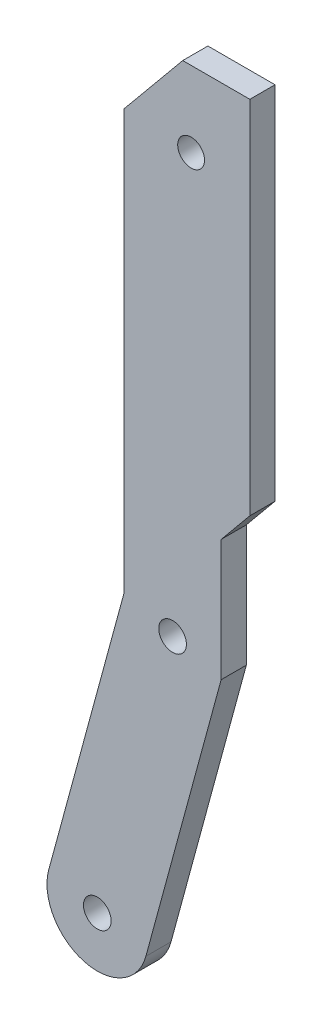
ISO-10303-21;
HEADER;
FILE_DESCRIPTION(('STEP AP214'),'2;1');
FILE_NAME('part.step','',(''),(''),'','','');
FILE_SCHEMA(('AUTOMOTIVE_DESIGN { 1 0 10303 214 1 1 1 1 }'));
ENDSEC;
DATA;
#1=APPLICATION_CONTEXT('core data for automotive mechanical design processes');
#2=APPLICATION_PROTOCOL_DEFINITION('international standard','automotive_design',2000,#1);
#3=PRODUCT_CONTEXT('',#1,'mechanical');
#4=PRODUCT('Part','Part','',(#3));
#5=PRODUCT_RELATED_PRODUCT_CATEGORY('part','',(#4));
#6=PRODUCT_DEFINITION_FORMATION('','',#4);
#7=PRODUCT_DEFINITION_CONTEXT('part definition',#1,'design');
#8=PRODUCT_DEFINITION('design','',#6,#7);
#9=PRODUCT_DEFINITION_SHAPE('','',#8);
#10=(LENGTH_UNIT() NAMED_UNIT(*) SI_UNIT(.MILLI.,.METRE.));
#11=(NAMED_UNIT(*) PLANE_ANGLE_UNIT() SI_UNIT($,.RADIAN.));
#12=(NAMED_UNIT(*) SI_UNIT($,.STERADIAN.) SOLID_ANGLE_UNIT());
#13=UNCERTAINTY_MEASURE_WITH_UNIT(LENGTH_MEASURE(1.E-05),#10,'distance_accuracy_value','');
#14=(GEOMETRIC_REPRESENTATION_CONTEXT(3) GLOBAL_UNCERTAINTY_ASSIGNED_CONTEXT((#13)) GLOBAL_UNIT_ASSIGNED_CONTEXT((#10,
#11,#12)) REPRESENTATION_CONTEXT('',''));
#15=CARTESIAN_POINT('',(0.,0.,0.));
#16=DIRECTION('',(0.,0.,1.));
#17=DIRECTION('',(1.,0.,0.));
#18=AXIS2_PLACEMENT_3D('',#15,#16,#17);
#19=CARTESIAN_POINT('',(-34.23086743438,0.,3.));
#20=DIRECTION('',(-1.,0.,0.));
#21=DIRECTION('',(0.,0.,1.));
#22=AXIS2_PLACEMENT_3D('',#19,#20,#21);
#23=PLANE('',#22);
#24=DIRECTION('',(0.,1.,0.));
#25=VECTOR('',#24,1.);
#26=CARTESIAN_POINT('',(-34.23086743438,0.,0.));
#27=LINE('',#26,#25);
#28=CARTESIAN_POINT('',(-34.2308674343806,39.5851457958507,0.));
#29=VERTEX_POINT('',#28);
#30=CARTESIAN_POINT('',(-34.23086743438,89.5851457958505,0.));
#31=VERTEX_POINT('',#30);
#32=EDGE_CURVE('E146',#29,#31,#27,.T.);
#33=ORIENTED_EDGE('',*,*,#32,.F.);
#34=DIRECTION('',(0.,0.,-1.));
#35=VECTOR('',#34,1.);
#36=CARTESIAN_POINT('',(-34.2308674343806,39.5851457958507,3.));
#37=LINE('',#36,#35);
#38=CARTESIAN_POINT('',(-34.2308674343806,39.5851457958507,3.));
#39=VERTEX_POINT('',#38);
#40=EDGE_CURVE('E11',#39,#29,#37,.T.);
#41=ORIENTED_EDGE('',*,*,#40,.F.);
#42=DIRECTION('',(0.,1.,0.));
#43=VECTOR('',#42,1.);
#44=CARTESIAN_POINT('',(-34.23086743438,0.,3.));
#45=LINE('',#44,#43);
#46=CARTESIAN_POINT('',(-34.23086743438,89.5851457958505,3.));
#47=VERTEX_POINT('',#46);
#48=EDGE_CURVE('E295',#39,#47,#45,.T.);
#49=ORIENTED_EDGE('',*,*,#48,.T.);
#50=DIRECTION('',(0.,0.,-1.));
#51=VECTOR('',#50,1.);
#52=CARTESIAN_POINT('',(-34.23086743438,89.5851457958505,3.));
#53=LINE('',#52,#51);
#54=EDGE_CURVE('E53',#47,#31,#53,.T.);
#55=ORIENTED_EDGE('',*,*,#54,.T.);
#56=EDGE_LOOP('',(#33,#41,#49,#55));
#57=FACE_BOUND('',#56,.T.);
#58=ADVANCED_FACE('F36',(#57),#23,.T.);
#59=CARTESIAN_POINT('',(-41.8913719289719,11.3761069547162,3.));
#60=DIRECTION('',(-0.965048701977236,0.262070606539634,0.));
#61=DIRECTION('',(-0.262070606539634,-0.965048701977236,0.));
#62=AXIS2_PLACEMENT_3D('',#59,#60,#61);
#63=PLANE('',#62);
#64=DIRECTION('',(0.262070606539634,0.965048701977236,0.));
#65=VECTOR('',#64,1.);
#66=CARTESIAN_POINT('',(-41.8913719289719,11.3761069547162,0.));
#67=LINE('',#66,#65);
#68=CARTESIAN_POINT('',(-43.2036515790819,6.54376886960462,0.));
#69=VERTEX_POINT('',#68);
#70=EDGE_CURVE('E148',#69,#29,#67,.T.);
#71=ORIENTED_EDGE('',*,*,#70,.F.);
#72=DIRECTION('',(0.,0.,-1.));
#73=VECTOR('',#72,1.);
#74=CARTESIAN_POINT('',(-43.2036515790819,6.54376886960462,3.));
#75=LINE('',#74,#73);
#76=CARTESIAN_POINT('',(-43.2036515790819,6.54376886960462,3.));
#77=VERTEX_POINT('',#76);
#78=EDGE_CURVE('E45',#77,#69,#75,.T.);
#79=ORIENTED_EDGE('',*,*,#78,.F.);
#80=DIRECTION('',(0.262070606539634,0.965048701977236,0.));
#81=VECTOR('',#80,1.);
#82=CARTESIAN_POINT('',(-41.8913719289719,11.3761069547162,3.));
#83=LINE('',#82,#81);
#84=EDGE_CURVE('E200',#77,#39,#83,.T.);
#85=ORIENTED_EDGE('',*,*,#84,.T.);
#86=ORIENTED_EDGE('',*,*,#40,.T.);
#87=EDGE_LOOP('',(#71,#79,#85,#86));
#88=FACE_BOUND('',#87,.T.);
#89=ADVANCED_FACE('F199',(#88),#63,.T.);
#90=CARTESIAN_POINT('',(-37.4133593672185,4.97134523036682,3.));
#91=DIRECTION('',(0.,0.,-1.));
#92=DIRECTION('',(-1.,0.,0.));
#93=AXIS2_PLACEMENT_3D('',#90,#91,#92);
#94=CYLINDRICAL_SURFACE('',#93,6.);
#95=CARTESIAN_POINT('',(-37.4133593672185,4.97134523036682,0.));
#96=DIRECTION('',(0.,0.,1.));
#97=DIRECTION('',(1.,0.,0.));
#98=AXIS2_PLACEMENT_3D('',#95,#96,#97);
#99=CIRCLE('',#98,6.);
#100=CARTESIAN_POINT('',(-31.6230671553551,3.39892159112893,0.));
#101=VERTEX_POINT('',#100);
#102=EDGE_CURVE('E151',#69,#101,#99,.T.);
#103=ORIENTED_EDGE('',*,*,#102,.T.);
#104=DIRECTION('',(0.,0.,-1.));
#105=VECTOR('',#104,1.);
#106=CARTESIAN_POINT('',(-31.6230671553551,3.39892159112893,3.));
#107=LINE('',#106,#105);
#108=CARTESIAN_POINT('',(-31.6230671553551,3.39892159112893,3.));
#109=VERTEX_POINT('',#108);
#110=EDGE_CURVE('E183',#109,#101,#107,.T.);
#111=ORIENTED_EDGE('',*,*,#110,.F.);
#112=CARTESIAN_POINT('',(-37.4133593672185,4.97134523036682,3.));
#113=DIRECTION('',(0.,0.,1.));
#114=DIRECTION('',(1.,0.,0.));
#115=AXIS2_PLACEMENT_3D('',#112,#113,#114);
#116=CIRCLE('',#115,6.);
#117=EDGE_CURVE('E191',#77,#109,#116,.T.);
#118=ORIENTED_EDGE('',*,*,#117,.F.);
#119=ORIENTED_EDGE('',*,*,#78,.T.);
#120=EDGE_LOOP('',(#103,#111,#118,#119));
#121=FACE_BOUND('',#120,.T.);
#122=ADVANCED_FACE('F188',(#121),#94,.T.);
#123=CARTESIAN_POINT('',(-30.3107875052449,8.23125967624103,3.));
#124=DIRECTION('',(-0.965048701977232,0.262070606539649,0.));
#125=DIRECTION('',(-0.262070606539649,-0.965048701977232,0.));
#126=AXIS2_PLACEMENT_3D('',#123,#124,#125);
#127=PLANE('',#126);
#128=DIRECTION('',(0.262070606539649,0.965048701977232,0.));
#129=VECTOR('',#128,1.);
#130=CARTESIAN_POINT('',(-30.3107875052449,8.23125967624103,0.));
#131=LINE('',#130,#129);
#132=CARTESIAN_POINT('',(-22.6502830106532,36.4402985173747,0.));
#133=VERTEX_POINT('',#132);
#134=EDGE_CURVE('E154',#101,#133,#131,.T.);
#135=ORIENTED_EDGE('',*,*,#134,.T.);
#136=DIRECTION('',(0.,0.,-1.));
#137=VECTOR('',#136,1.);
#138=CARTESIAN_POINT('',(-22.6502830106532,36.4402985173747,3.));
#139=LINE('',#138,#137);
#140=CARTESIAN_POINT('',(-22.6502830106532,36.4402985173747,3.));
#141=VERTEX_POINT('',#140);
#142=EDGE_CURVE('E181',#141,#133,#139,.T.);
#143=ORIENTED_EDGE('',*,*,#142,.F.);
#144=DIRECTION('',(0.262070606539649,0.965048701977232,0.));
#145=VECTOR('',#144,1.);
#146=CARTESIAN_POINT('',(-30.3107875052449,8.23125967624103,3.));
#147=LINE('',#146,#145);
#148=EDGE_CURVE('E301',#109,#141,#147,.T.);
#149=ORIENTED_EDGE('',*,*,#148,.F.);
#150=ORIENTED_EDGE('',*,*,#110,.T.);
#151=EDGE_LOOP('',(#135,#143,#149,#150));
#152=FACE_BOUND('',#151,.T.);
#153=ADVANCED_FACE('F222',(#152),#127,.F.);
#154=CARTESIAN_POINT('',(-22.6502830106532,0.,3.));
#155=DIRECTION('',(1.,0.,0.));
#156=DIRECTION('',(0.,1.,0.));
#157=AXIS2_PLACEMENT_3D('',#154,#155,#156);
#158=PLANE('',#157);
#159=DIRECTION('',(0.,-1.,0.));
#160=VECTOR('',#159,1.);
#161=CARTESIAN_POINT('',(-22.6502830106532,0.,0.));
#162=LINE('',#161,#160);
#163=CARTESIAN_POINT('',(-22.6502830106533,50.9255690070684,0.));
#164=VERTEX_POINT('',#163);
#165=EDGE_CURVE('E157',#164,#133,#162,.T.);
#166=ORIENTED_EDGE('',*,*,#165,.F.);
#167=DIRECTION('',(0.,0.,-1.));
#168=VECTOR('',#167,1.);
#169=CARTESIAN_POINT('',(-22.6502830106533,50.9255690070684,3.));
#170=LINE('',#169,#168);
#171=CARTESIAN_POINT('',(-22.6502830106533,50.9255690070684,3.));
#172=VERTEX_POINT('',#171);
#173=EDGE_CURVE('E179',#172,#164,#170,.T.);
#174=ORIENTED_EDGE('',*,*,#173,.F.);
#175=DIRECTION('',(0.,-1.,0.));
#176=VECTOR('',#175,1.);
#177=CARTESIAN_POINT('',(-22.6502830106532,0.,3.));
#178=LINE('',#177,#176);
#179=EDGE_CURVE('E303',#172,#141,#178,.T.);
#180=ORIENTED_EDGE('',*,*,#179,.T.);
#181=ORIENTED_EDGE('',*,*,#142,.T.);
#182=EDGE_LOOP('',(#166,#174,#180,#181));
#183=FACE_BOUND('',#182,.T.);
#184=ADVANCED_FACE('F225',(#183),#158,.T.);
#185=CARTESIAN_POINT('',(-38.4764037350767,31.7414136628682,3.));
#186=DIRECTION('',(0.77138921583987,-0.636363636363637,0.));
#187=DIRECTION('',(0.636363636363637,0.77138921583987,0.));
#188=AXIS2_PLACEMENT_3D('',#185,#186,#187);
#189=PLANE('',#188);
#190=DIRECTION('',(-0.636363636363637,-0.77138921583987,0.));
#191=VECTOR('',#190,1.);
#192=CARTESIAN_POINT('',(-38.4764037350767,31.7414136628682,0.));
#193=LINE('',#192,#191);
#194=CARTESIAN_POINT('',(-19.23086743438,55.070526621373,0.));
#195=VERTEX_POINT('',#194);
#196=EDGE_CURVE('E160',#195,#164,#193,.T.);
#197=ORIENTED_EDGE('',*,*,#196,.F.);
#198=DIRECTION('',(0.,0.,-1.));
#199=VECTOR('',#198,1.);
#200=CARTESIAN_POINT('',(-19.23086743438,55.070526621373,3.));
#201=LINE('',#200,#199);
#202=CARTESIAN_POINT('',(-19.23086743438,55.070526621373,3.));
#203=VERTEX_POINT('',#202);
#204=EDGE_CURVE('E118',#203,#195,#201,.T.);
#205=ORIENTED_EDGE('',*,*,#204,.F.);
#206=DIRECTION('',(-0.636363636363637,-0.77138921583987,0.));
#207=VECTOR('',#206,1.);
#208=CARTESIAN_POINT('',(-38.4764037350767,31.7414136628682,3.));
#209=LINE('',#208,#207);
#210=EDGE_CURVE('E129',#203,#172,#209,.T.);
#211=ORIENTED_EDGE('',*,*,#210,.T.);
#212=ORIENTED_EDGE('',*,*,#173,.T.);
#213=EDGE_LOOP('',(#197,#205,#211,#212));
#214=FACE_BOUND('',#213,.T.);
#215=ADVANCED_FACE('F229',(#214),#189,.T.);
#216=CARTESIAN_POINT('',(-19.23086743438,0.,3.));
#217=DIRECTION('',(1.,0.,0.));
#218=DIRECTION('',(0.,1.,0.));
#219=AXIS2_PLACEMENT_3D('',#216,#217,#218);
#220=PLANE('',#219);
#221=DIRECTION('',(0.,-1.,0.));
#222=VECTOR('',#221,1.);
#223=CARTESIAN_POINT('',(-19.23086743438,0.,0.));
#224=LINE('',#223,#222);
#225=CARTESIAN_POINT('',(-19.23086743438,98.0704271700891,0.));
#226=VERTEX_POINT('',#225);
#227=EDGE_CURVE('E114',#226,#195,#224,.T.);
#228=ORIENTED_EDGE('',*,*,#227,.F.);
#229=DIRECTION('',(0.,0.,-1.));
#230=VECTOR('',#229,1.);
#231=CARTESIAN_POINT('',(-19.23086743438,98.0704271700891,3.));
#232=LINE('',#231,#230);
#233=CARTESIAN_POINT('',(-19.23086743438,98.0704271700891,3.));
#234=VERTEX_POINT('',#233);
#235=EDGE_CURVE('E109',#234,#226,#232,.T.);
#236=ORIENTED_EDGE('',*,*,#235,.F.);
#237=DIRECTION('',(0.,-1.,0.));
#238=VECTOR('',#237,1.);
#239=CARTESIAN_POINT('',(-19.23086743438,0.,3.));
#240=LINE('',#239,#238);
#241=EDGE_CURVE('E112',#234,#203,#240,.T.);
#242=ORIENTED_EDGE('',*,*,#241,.T.);
#243=ORIENTED_EDGE('',*,*,#204,.T.);
#244=EDGE_LOOP('',(#228,#236,#242,#243));
#245=FACE_BOUND('',#244,.T.);
#246=ADVANCED_FACE('F111',(#245),#220,.T.);
#247=CARTESIAN_POINT('',(0.,98.0704271700891,3.));
#248=DIRECTION('',(0.,1.,0.));
#249=DIRECTION('',(0.,0.,1.));
#250=AXIS2_PLACEMENT_3D('',#247,#248,#249);
#251=PLANE('',#250);
#252=DIRECTION('',(1.,0.,0.));
#253=VECTOR('',#252,1.);
#254=CARTESIAN_POINT('',(0.,98.0704271700891,0.));
#255=LINE('',#254,#253);
#256=CARTESIAN_POINT('',(-27.23086743438,98.0704271700891,0.));
#257=VERTEX_POINT('',#256);
#258=EDGE_CURVE('E164',#257,#226,#255,.T.);
#259=ORIENTED_EDGE('',*,*,#258,.F.);
#260=DIRECTION('',(0.,0.,-1.));
#261=VECTOR('',#260,1.);
#262=CARTESIAN_POINT('',(-27.23086743438,98.0704271700891,3.));
#263=LINE('',#262,#261);
#264=CARTESIAN_POINT('',(-27.23086743438,98.0704271700891,3.));
#265=VERTEX_POINT('',#264);
#266=EDGE_CURVE('E81',#265,#257,#263,.T.);
#267=ORIENTED_EDGE('',*,*,#266,.F.);
#268=DIRECTION('',(1.,0.,0.));
#269=VECTOR('',#268,1.);
#270=CARTESIAN_POINT('',(0.,98.0704271700891,3.));
#271=LINE('',#270,#269);
#272=EDGE_CURVE('E126',#265,#234,#271,.T.);
#273=ORIENTED_EDGE('',*,*,#272,.T.);
#274=ORIENTED_EDGE('',*,*,#235,.T.);
#275=EDGE_LOOP('',(#259,#267,#273,#274));
#276=FACE_BOUND('',#275,.T.);
#277=ADVANCED_FACE('F131',(#276),#251,.T.);
#278=CARTESIAN_POINT('',(-28.4405752225166,38.0127221566126,3.));
#279=DIRECTION('',(0.,0.,-1.));
#280=DIRECTION('',(-1.,0.,0.));
#281=AXIS2_PLACEMENT_3D('',#278,#279,#280);
#282=CYLINDRICAL_SURFACE('',#281,1.65);
#283=CARTESIAN_POINT('',(-28.4405752225166,38.0127221566126,3.));
#284=DIRECTION('',(0.,0.,1.));
#285=DIRECTION('',(1.,0.,0.));
#286=AXIS2_PLACEMENT_3D('',#283,#284,#285);
#287=CIRCLE('',#286,1.65);
#288=CARTESIAN_POINT('',(-26.7905752225166,38.0127221566126,3.));
#289=VERTEX_POINT('',#288);
#290=EDGE_CURVE('E134',#289,#289,#287,.T.);
#291=ORIENTED_EDGE('',*,*,#290,.T.);
#292=EDGE_LOOP('',(#291));
#293=FACE_BOUND('',#292,.T.);
#294=CARTESIAN_POINT('',(-28.4405752225166,38.0127221566126,0.));
#295=DIRECTION('',(0.,0.,1.));
#296=DIRECTION('',(1.,0.,0.));
#297=AXIS2_PLACEMENT_3D('',#294,#295,#296);
#298=CIRCLE('',#297,1.65);
#299=CARTESIAN_POINT('',(-26.7905752225166,38.0127221566126,0.));
#300=VERTEX_POINT('',#299);
#301=EDGE_CURVE('E169',#300,#300,#298,.T.);
#302=ORIENTED_EDGE('',*,*,#301,.F.);
#303=EDGE_LOOP('',(#302));
#304=FACE_BOUND('',#303,.T.);
#305=ADVANCED_FACE('F203',(#293,#304),#282,.F.);
#306=CARTESIAN_POINT('',(-64.3446994916133,53.0816689012521,3.));
#307=DIRECTION('',(-0.77138921583987,0.636363636363636,0.));
#308=DIRECTION('',(-0.636363636363636,-0.77138921583987,0.));
#309=AXIS2_PLACEMENT_3D('',#306,#307,#308);
#310=PLANE('',#309);
#311=DIRECTION('',(0.636363636363636,0.77138921583987,0.));
#312=VECTOR('',#311,1.);
#313=CARTESIAN_POINT('',(-64.3446994916133,53.0816689012521,0.));
#314=LINE('',#313,#312);
#315=EDGE_CURVE('E166',#31,#257,#314,.T.);
#316=ORIENTED_EDGE('',*,*,#315,.F.);
#317=ORIENTED_EDGE('',*,*,#54,.F.);
#318=DIRECTION('',(0.636363636363636,0.77138921583987,0.));
#319=VECTOR('',#318,1.);
#320=CARTESIAN_POINT('',(-64.3446994916133,53.0816689012521,3.));
#321=LINE('',#320,#319);
#322=EDGE_CURVE('E132',#47,#265,#321,.T.);
#323=ORIENTED_EDGE('',*,*,#322,.T.);
#324=ORIENTED_EDGE('',*,*,#266,.T.);
#325=EDGE_LOOP('',(#316,#317,#323,#324));
#326=FACE_BOUND('',#325,.T.);
#327=ADVANCED_FACE('F201',(#326),#310,.T.);
#328=CARTESIAN_POINT('',(-26.23086743438,89.0704271700891,3.));
#329=DIRECTION('',(0.,0.,-1.));
#330=DIRECTION('',(-1.,0.,0.));
#331=AXIS2_PLACEMENT_3D('',#328,#329,#330);
#332=CYLINDRICAL_SURFACE('',#331,1.60000000000001);
#333=CARTESIAN_POINT('',(-26.23086743438,89.0704271700891,3.));
#334=DIRECTION('',(0.,0.,1.));
#335=DIRECTION('',(1.,0.,0.));
#336=AXIS2_PLACEMENT_3D('',#333,#334,#335);
#337=CIRCLE('',#336,1.60000000000001);
#338=CARTESIAN_POINT('',(-24.63086743438,89.0704271700891,3.));
#339=VERTEX_POINT('',#338);
#340=EDGE_CURVE('E175',#339,#339,#337,.T.);
#341=ORIENTED_EDGE('',*,*,#340,.T.);
#342=EDGE_LOOP('',(#341));
#343=FACE_BOUND('',#342,.T.);
#344=CARTESIAN_POINT('',(-26.23086743438,89.0704271700891,0.));
#345=DIRECTION('',(0.,0.,1.));
#346=DIRECTION('',(1.,0.,0.));
#347=AXIS2_PLACEMENT_3D('',#344,#345,#346);
#348=CIRCLE('',#347,1.60000000000001);
#349=CARTESIAN_POINT('',(-24.63086743438,89.0704271700891,0.));
#350=VERTEX_POINT('',#349);
#351=EDGE_CURVE('E143',#350,#350,#348,.T.);
#352=ORIENTED_EDGE('',*,*,#351,.F.);
#353=EDGE_LOOP('',(#352));
#354=FACE_BOUND('',#353,.T.);
#355=ADVANCED_FACE('F38',(#343,#354),#332,.F.);
#356=CARTESIAN_POINT('',(-37.4133593672185,4.97134523036682,3.));
#357=DIRECTION('',(0.,0.,-1.));
#358=DIRECTION('',(-1.,0.,0.));
#359=AXIS2_PLACEMENT_3D('',#356,#357,#358);
#360=CYLINDRICAL_SURFACE('',#359,1.65);
#361=CARTESIAN_POINT('',(-37.4133593672185,4.97134523036682,3.));
#362=DIRECTION('',(0.,0.,1.));
#363=DIRECTION('',(1.,0.,0.));
#364=AXIS2_PLACEMENT_3D('',#361,#362,#363);
#365=CIRCLE('',#364,1.65);
#366=CARTESIAN_POINT('',(-35.7633593672185,4.97134523036682,3.));
#367=VERTEX_POINT('',#366);
#368=EDGE_CURVE('E140',#367,#367,#365,.T.);
#369=ORIENTED_EDGE('',*,*,#368,.T.);
#370=EDGE_LOOP('',(#369));
#371=FACE_BOUND('',#370,.T.);
#372=CARTESIAN_POINT('',(-37.4133593672185,4.97134523036682,0.));
#373=DIRECTION('',(0.,0.,1.));
#374=DIRECTION('',(1.,0.,0.));
#375=AXIS2_PLACEMENT_3D('',#372,#373,#374);
#376=CIRCLE('',#375,1.65);
#377=CARTESIAN_POINT('',(-35.7633593672185,4.97134523036682,0.));
#378=VERTEX_POINT('',#377);
#379=EDGE_CURVE('E172',#378,#378,#376,.T.);
#380=ORIENTED_EDGE('',*,*,#379,.F.);
#381=EDGE_LOOP('',(#380));
#382=FACE_BOUND('',#381,.T.);
#383=ADVANCED_FACE('F209',(#371,#382),#360,.F.);
#384=CARTESIAN_POINT('',(0.,0.,3.));
#385=DIRECTION('',(0.,0.,1.));
#386=DIRECTION('',(1.,0.,0.));
#387=AXIS2_PLACEMENT_3D('',#384,#385,#386);
#388=PLANE('',#387);
#389=ORIENTED_EDGE('',*,*,#340,.F.);
#390=EDGE_LOOP('',(#389));
#391=FACE_BOUND('',#390,.T.);
#392=ORIENTED_EDGE('',*,*,#48,.F.);
#393=ORIENTED_EDGE('',*,*,#84,.F.);
#394=ORIENTED_EDGE('',*,*,#117,.T.);
#395=ORIENTED_EDGE('',*,*,#148,.T.);
#396=ORIENTED_EDGE('',*,*,#179,.F.);
#397=ORIENTED_EDGE('',*,*,#210,.F.);
#398=ORIENTED_EDGE('',*,*,#241,.F.);
#399=ORIENTED_EDGE('',*,*,#272,.F.);
#400=ORIENTED_EDGE('',*,*,#322,.F.);
#401=EDGE_LOOP('',(#392,#393,#394,#395,#396,#397,#398,#399,#400));
#402=FACE_BOUND('',#401,.T.);
#403=ORIENTED_EDGE('',*,*,#290,.F.);
#404=EDGE_LOOP('',(#403));
#405=FACE_BOUND('',#404,.T.);
#406=ORIENTED_EDGE('',*,*,#368,.F.);
#407=EDGE_LOOP('',(#406));
#408=FACE_BOUND('',#407,.T.);
#409=ADVANCED_FACE('F123',(#391,#402,#405,#408),#388,.T.);
#410=CARTESIAN_POINT('',(0.,0.,0.));
#411=DIRECTION('',(0.,0.,1.));
#412=DIRECTION('',(1.,0.,0.));
#413=AXIS2_PLACEMENT_3D('',#410,#411,#412);
#414=PLANE('',#413);
#415=ORIENTED_EDGE('',*,*,#351,.T.);
#416=EDGE_LOOP('',(#415));
#417=FACE_BOUND('',#416,.T.);
#418=ORIENTED_EDGE('',*,*,#32,.T.);
#419=ORIENTED_EDGE('',*,*,#315,.T.);
#420=ORIENTED_EDGE('',*,*,#258,.T.);
#421=ORIENTED_EDGE('',*,*,#227,.T.);
#422=ORIENTED_EDGE('',*,*,#196,.T.);
#423=ORIENTED_EDGE('',*,*,#165,.T.);
#424=ORIENTED_EDGE('',*,*,#134,.F.);
#425=ORIENTED_EDGE('',*,*,#102,.F.);
#426=ORIENTED_EDGE('',*,*,#70,.T.);
#427=EDGE_LOOP('',(#418,#419,#420,#421,#422,#423,#424,#425,#426));
#428=FACE_BOUND('',#427,.T.);
#429=ORIENTED_EDGE('',*,*,#301,.T.);
#430=EDGE_LOOP('',(#429));
#431=FACE_BOUND('',#430,.T.);
#432=ORIENTED_EDGE('',*,*,#379,.T.);
#433=EDGE_LOOP('',(#432));
#434=FACE_BOUND('',#433,.T.);
#435=ADVANCED_FACE('F197',(#417,#428,#431,#434),#414,.F.);
#436=CLOSED_SHELL('',(#58,#89,#122,#153,#184,#215,#246,#277,#305,#327,#355,#383,#409,#435));
#437=MANIFOLD_SOLID_BREP('B2',#436);
#438=ADVANCED_BREP_SHAPE_REPRESENTATION('',(#18,#437),#14);
#439=SHAPE_DEFINITION_REPRESENTATION(#9,#438);
ENDSEC;
END-ISO-10303-21;
